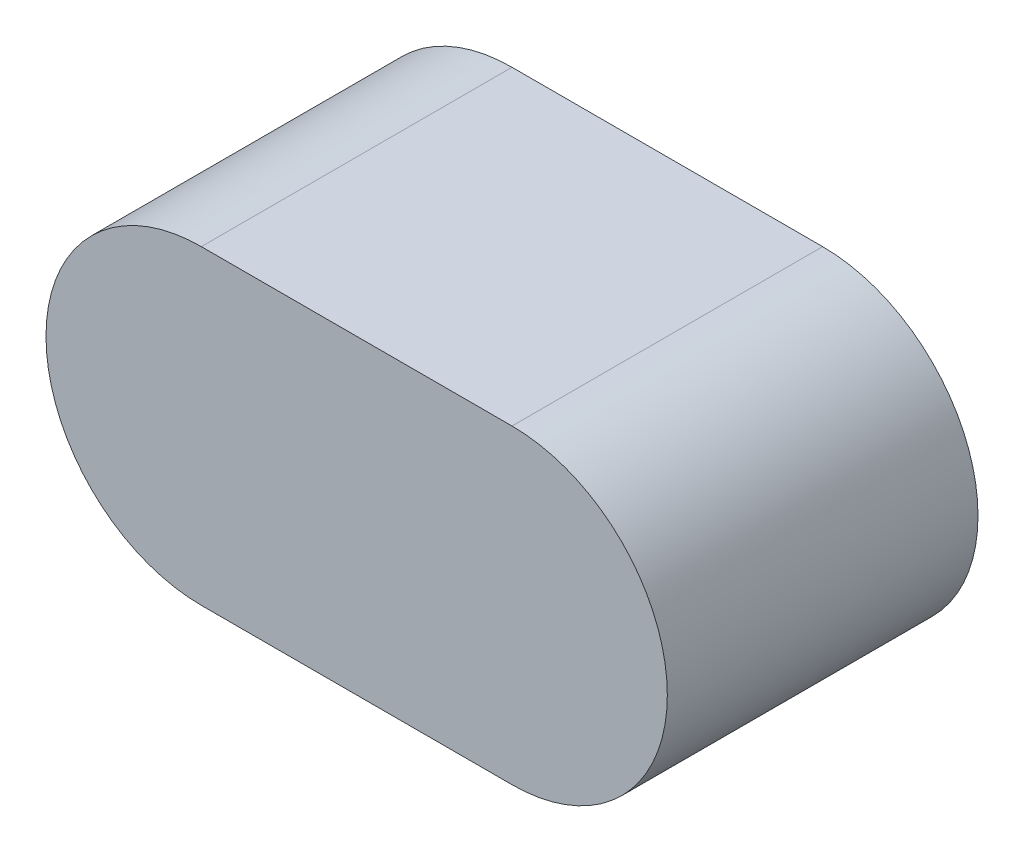
ISO-10303-21;
HEADER;
FILE_DESCRIPTION(('STEP AP214'),'2;1');
FILE_NAME('part.step','',(''),(''),'','','');
FILE_SCHEMA(('AUTOMOTIVE_DESIGN { 1 0 10303 214 1 1 1 1 }'));
ENDSEC;
DATA;
#1=APPLICATION_CONTEXT('core data for automotive mechanical design processes');
#2=APPLICATION_PROTOCOL_DEFINITION('international standard','automotive_design',2000,#1);
#3=PRODUCT_CONTEXT('',#1,'mechanical');
#4=PRODUCT('Part','Part','',(#3));
#5=PRODUCT_RELATED_PRODUCT_CATEGORY('part','',(#4));
#6=PRODUCT_DEFINITION_FORMATION('','',#4);
#7=PRODUCT_DEFINITION_CONTEXT('part definition',#1,'design');
#8=PRODUCT_DEFINITION('design','',#6,#7);
#9=PRODUCT_DEFINITION_SHAPE('','',#8);
#10=(LENGTH_UNIT() NAMED_UNIT(*) SI_UNIT(.MILLI.,.METRE.));
#11=(NAMED_UNIT(*) PLANE_ANGLE_UNIT() SI_UNIT($,.RADIAN.));
#12=(NAMED_UNIT(*) SI_UNIT($,.STERADIAN.) SOLID_ANGLE_UNIT());
#13=UNCERTAINTY_MEASURE_WITH_UNIT(LENGTH_MEASURE(1.E-05),#10,'distance_accuracy_value','');
#14=(GEOMETRIC_REPRESENTATION_CONTEXT(3) GLOBAL_UNCERTAINTY_ASSIGNED_CONTEXT((#13)) GLOBAL_UNIT_ASSIGNED_CONTEXT((#10,
#11,#12)) REPRESENTATION_CONTEXT('',''));
#15=CARTESIAN_POINT('',(0.,0.,0.));
#16=DIRECTION('',(0.,0.,1.));
#17=DIRECTION('',(1.,0.,0.));
#18=AXIS2_PLACEMENT_3D('',#15,#16,#17);
#19=CARTESIAN_POINT('',(-50.7978723404255,48.8297872340426,5.));
#20=DIRECTION('',(0.,0.,-1.));
#21=DIRECTION('',(-1.,0.,0.));
#22=AXIS2_PLACEMENT_3D('',#19,#20,#21);
#23=CYLINDRICAL_SURFACE('',#22,2.49999999999998);
#24=CARTESIAN_POINT('',(-50.7978723404255,48.8297872340426,0.));
#25=DIRECTION('',(0.,0.,1.));
#26=DIRECTION('',(1.,0.,0.));
#27=AXIS2_PLACEMENT_3D('',#24,#25,#26);
#28=CIRCLE('',#27,2.49999999999998);
#29=CARTESIAN_POINT('',(-50.7978723404255,51.3297872340426,0.));
#30=VERTEX_POINT('',#29);
#31=CARTESIAN_POINT('',(-50.7978723404255,46.3297872340426,0.));
#32=VERTEX_POINT('',#31);
#33=EDGE_CURVE('E102',#30,#32,#28,.T.);
#34=ORIENTED_EDGE('',*,*,#33,.T.);
#35=DIRECTION('',(0.,0.,-1.));
#36=VECTOR('',#35,1.);
#37=CARTESIAN_POINT('',(-50.7978723404255,46.3297872340426,5.));
#38=LINE('',#37,#36);
#39=CARTESIAN_POINT('',(-50.7978723404255,46.3297872340426,5.));
#40=VERTEX_POINT('',#39);
#41=EDGE_CURVE('E11',#40,#32,#38,.T.);
#42=ORIENTED_EDGE('',*,*,#41,.F.);
#43=CARTESIAN_POINT('',(-50.7978723404255,48.8297872340426,5.));
#44=DIRECTION('',(0.,0.,1.));
#45=DIRECTION('',(1.,0.,0.));
#46=AXIS2_PLACEMENT_3D('',#43,#44,#45);
#47=CIRCLE('',#46,2.49999999999998);
#48=CARTESIAN_POINT('',(-50.7978723404255,51.3297872340426,5.));
#49=VERTEX_POINT('',#48);
#50=EDGE_CURVE('E90',#49,#40,#47,.T.);
#51=ORIENTED_EDGE('',*,*,#50,.F.);
#52=DIRECTION('',(0.,0.,-1.));
#53=VECTOR('',#52,1.);
#54=CARTESIAN_POINT('',(-50.7978723404255,51.3297872340426,5.));
#55=LINE('',#54,#53);
#56=EDGE_CURVE('E98',#49,#30,#55,.T.);
#57=ORIENTED_EDGE('',*,*,#56,.T.);
#58=EDGE_LOOP('',(#34,#42,#51,#57));
#59=FACE_BOUND('',#58,.T.);
#60=ADVANCED_FACE('F39',(#59),#23,.T.);
#61=CARTESIAN_POINT('',(-50.7978723404255,46.3297872340426,5.));
#62=DIRECTION('',(0.,1.,0.));
#63=DIRECTION('',(-1.,0.,0.));
#64=AXIS2_PLACEMENT_3D('',#61,#62,#63);
#65=PLANE('',#64);
#66=DIRECTION('',(1.,0.,0.));
#67=VECTOR('',#66,1.);
#68=CARTESIAN_POINT('',(-50.7978723404255,46.3297872340426,0.));
#69=LINE('',#68,#67);
#70=CARTESIAN_POINT('',(-45.7978723404255,46.3297872340426,0.));
#71=VERTEX_POINT('',#70);
#72=EDGE_CURVE('E94',#32,#71,#69,.T.);
#73=ORIENTED_EDGE('',*,*,#72,.T.);
#74=DIRECTION('',(0.,0.,-1.));
#75=VECTOR('',#74,1.);
#76=CARTESIAN_POINT('',(-45.7978723404255,46.3297872340426,5.));
#77=LINE('',#76,#75);
#78=CARTESIAN_POINT('',(-45.7978723404255,46.3297872340426,5.));
#79=VERTEX_POINT('',#78);
#80=EDGE_CURVE('E47',#79,#71,#77,.T.);
#81=ORIENTED_EDGE('',*,*,#80,.F.);
#82=DIRECTION('',(1.,0.,0.));
#83=VECTOR('',#82,1.);
#84=CARTESIAN_POINT('',(-50.7978723404255,46.3297872340426,5.));
#85=LINE('',#84,#83);
#86=EDGE_CURVE('E85',#40,#79,#85,.T.);
#87=ORIENTED_EDGE('',*,*,#86,.F.);
#88=ORIENTED_EDGE('',*,*,#41,.T.);
#89=EDGE_LOOP('',(#73,#81,#87,#88));
#90=FACE_BOUND('',#89,.T.);
#91=ADVANCED_FACE('F93',(#90),#65,.F.);
#92=CARTESIAN_POINT('',(-45.7978723404255,48.8297872340426,5.));
#93=DIRECTION('',(0.,0.,-1.));
#94=DIRECTION('',(-1.,0.,0.));
#95=AXIS2_PLACEMENT_3D('',#92,#93,#94);
#96=CYLINDRICAL_SURFACE('',#95,2.5);
#97=CARTESIAN_POINT('',(-45.7978723404255,48.8297872340426,0.));
#98=DIRECTION('',(0.,0.,1.));
#99=DIRECTION('',(1.,0.,0.));
#100=AXIS2_PLACEMENT_3D('',#97,#98,#99);
#101=CIRCLE('',#100,2.5);
#102=CARTESIAN_POINT('',(-45.7978723404255,51.3297872340426,0.));
#103=VERTEX_POINT('',#102);
#104=EDGE_CURVE('E72',#71,#103,#101,.T.);
#105=ORIENTED_EDGE('',*,*,#104,.T.);
#106=DIRECTION('',(0.,0.,-1.));
#107=VECTOR('',#106,1.);
#108=CARTESIAN_POINT('',(-45.7978723404255,51.3297872340426,5.));
#109=LINE('',#108,#107);
#110=CARTESIAN_POINT('',(-45.7978723404255,51.3297872340426,5.));
#111=VERTEX_POINT('',#110);
#112=EDGE_CURVE('E95',#111,#103,#109,.T.);
#113=ORIENTED_EDGE('',*,*,#112,.F.);
#114=CARTESIAN_POINT('',(-45.7978723404255,48.8297872340426,5.));
#115=DIRECTION('',(0.,0.,1.));
#116=DIRECTION('',(1.,0.,0.));
#117=AXIS2_PLACEMENT_3D('',#114,#115,#116);
#118=CIRCLE('',#117,2.5);
#119=EDGE_CURVE('E88',#79,#111,#118,.T.);
#120=ORIENTED_EDGE('',*,*,#119,.F.);
#121=ORIENTED_EDGE('',*,*,#80,.T.);
#122=EDGE_LOOP('',(#105,#113,#120,#121));
#123=FACE_BOUND('',#122,.T.);
#124=ADVANCED_FACE('F96',(#123),#96,.T.);
#125=CARTESIAN_POINT('',(-50.7978723404255,51.3297872340426,5.));
#126=DIRECTION('',(0.,-1.,0.));
#127=DIRECTION('',(0.,0.,-1.));
#128=AXIS2_PLACEMENT_3D('',#125,#126,#127);
#129=PLANE('',#128);
#130=DIRECTION('',(-1.,0.,0.));
#131=VECTOR('',#130,1.);
#132=CARTESIAN_POINT('',(-50.7978723404255,51.3297872340426,0.));
#133=LINE('',#132,#131);
#134=EDGE_CURVE('E78',#103,#30,#133,.T.);
#135=ORIENTED_EDGE('',*,*,#134,.T.);
#136=ORIENTED_EDGE('',*,*,#56,.F.);
#137=DIRECTION('',(-1.,0.,0.));
#138=VECTOR('',#137,1.);
#139=CARTESIAN_POINT('',(-50.7978723404255,51.3297872340426,5.));
#140=LINE('',#139,#138);
#141=EDGE_CURVE('E55',#111,#49,#140,.T.);
#142=ORIENTED_EDGE('',*,*,#141,.F.);
#143=ORIENTED_EDGE('',*,*,#112,.T.);
#144=EDGE_LOOP('',(#135,#136,#142,#143));
#145=FACE_BOUND('',#144,.T.);
#146=ADVANCED_FACE('F109',(#145),#129,.F.);
#147=CARTESIAN_POINT('',(-50.7978723404255,48.8297872340426,5.));
#148=DIRECTION('',(0.,0.,1.));
#149=DIRECTION('',(1.,0.,0.));
#150=AXIS2_PLACEMENT_3D('',#147,#148,#149);
#151=PLANE('',#150);
#152=ORIENTED_EDGE('',*,*,#50,.T.);
#153=ORIENTED_EDGE('',*,*,#86,.T.);
#154=ORIENTED_EDGE('',*,*,#119,.T.);
#155=ORIENTED_EDGE('',*,*,#141,.T.);
#156=EDGE_LOOP('',(#152,#153,#154,#155));
#157=FACE_BOUND('',#156,.T.);
#158=ADVANCED_FACE('F86',(#157),#151,.T.);
#159=CARTESIAN_POINT('',(-50.7978723404255,48.8297872340426,0.));
#160=DIRECTION('',(0.,0.,1.));
#161=DIRECTION('',(1.,0.,0.));
#162=AXIS2_PLACEMENT_3D('',#159,#160,#161);
#163=PLANE('',#162);
#164=ORIENTED_EDGE('',*,*,#33,.F.);
#165=ORIENTED_EDGE('',*,*,#134,.F.);
#166=ORIENTED_EDGE('',*,*,#104,.F.);
#167=ORIENTED_EDGE('',*,*,#72,.F.);
#168=EDGE_LOOP('',(#164,#165,#166,#167));
#169=FACE_BOUND('',#168,.T.);
#170=ADVANCED_FACE('F112',(#169),#163,.F.);
#171=CLOSED_SHELL('',(#60,#91,#124,#146,#158,#170));
#172=MANIFOLD_SOLID_BREP('B2',#171);
#173=ADVANCED_BREP_SHAPE_REPRESENTATION('',(#18,#172),#14);
#174=SHAPE_DEFINITION_REPRESENTATION(#9,#173);
ENDSEC;
END-ISO-10303-21;
